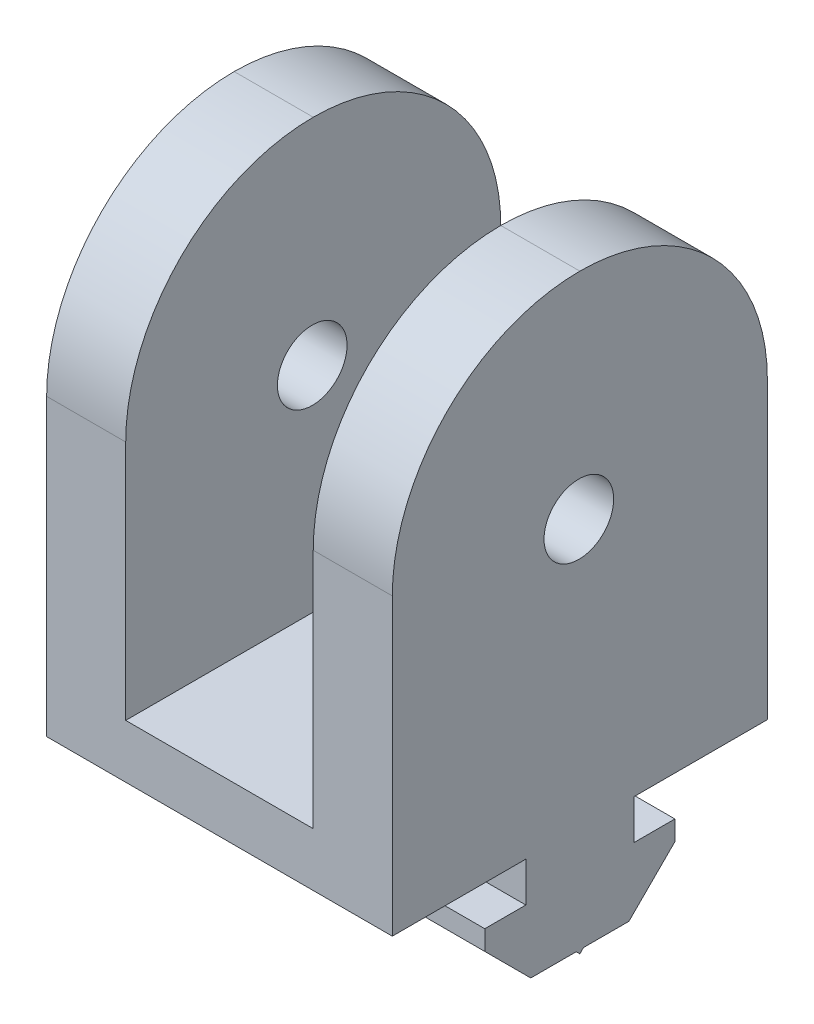
ISO-10303-21;
HEADER;
FILE_DESCRIPTION(('STEP AP214'),'2;1');
FILE_NAME('part.step','',(''),(''),'','','');
FILE_SCHEMA(('AUTOMOTIVE_DESIGN { 1 0 10303 214 1 1 1 1 }'));
ENDSEC;
DATA;
#1=APPLICATION_CONTEXT('core data for automotive mechanical design processes');
#2=APPLICATION_PROTOCOL_DEFINITION('international standard','automotive_design',2000,#1);
#3=PRODUCT_CONTEXT('',#1,'mechanical');
#4=PRODUCT('Part','Part','',(#3));
#5=PRODUCT_RELATED_PRODUCT_CATEGORY('part','',(#4));
#6=PRODUCT_DEFINITION_FORMATION('','',#4);
#7=PRODUCT_DEFINITION_CONTEXT('part definition',#1,'design');
#8=PRODUCT_DEFINITION('design','',#6,#7);
#9=PRODUCT_DEFINITION_SHAPE('','',#8);
#10=(LENGTH_UNIT() NAMED_UNIT(*) SI_UNIT(.MILLI.,.METRE.));
#11=(NAMED_UNIT(*) PLANE_ANGLE_UNIT() SI_UNIT($,.RADIAN.));
#12=(NAMED_UNIT(*) SI_UNIT($,.STERADIAN.) SOLID_ANGLE_UNIT());
#13=UNCERTAINTY_MEASURE_WITH_UNIT(LENGTH_MEASURE(1.E-05),#10,'distance_accuracy_value','');
#14=(GEOMETRIC_REPRESENTATION_CONTEXT(3) GLOBAL_UNCERTAINTY_ASSIGNED_CONTEXT((#13)) GLOBAL_UNIT_ASSIGNED_CONTEXT((#10,
#11,#12)) REPRESENTATION_CONTEXT('',''));
#15=CARTESIAN_POINT('',(0.,0.,0.));
#16=DIRECTION('',(0.,0.,1.));
#17=DIRECTION('',(1.,0.,0.));
#18=AXIS2_PLACEMENT_3D('',#15,#16,#17);
#19=CARTESIAN_POINT('',(0.,0.,0.));
#20=DIRECTION('',(0.,1.,0.));
#21=DIRECTION('',(0.,0.,1.));
#22=AXIS2_PLACEMENT_3D('',#19,#20,#21);
#23=PLANE('',#22);
#24=DIRECTION('',(1.,0.,0.));
#25=VECTOR('',#24,1.);
#26=CARTESIAN_POINT('',(-11.6351031276717,0.,-1.56619318181818));
#27=LINE('',#26,#25);
#28=CARTESIAN_POINT('',(-11.6351031276717,0.,-1.56619318181818));
#29=VERTEX_POINT('',#28);
#30=CARTESIAN_POINT('',(8.3648968723283,0.,-1.56619318181818));
#31=VERTEX_POINT('',#30);
#32=EDGE_CURVE('E284',#29,#31,#27,.T.);
#33=ORIENTED_EDGE('',*,*,#32,.F.);
#34=DIRECTION('',(0.,0.,-1.));
#35=VECTOR('',#34,1.);
#36=CARTESIAN_POINT('',(-11.6351031276717,0.,46.3308796469463));
#37=LINE('',#36,#35);
#38=CARTESIAN_POINT('',(-11.6351031276717,0.,-9.29119318181818));
#39=VERTEX_POINT('',#38);
#40=EDGE_CURVE('E311',#29,#39,#37,.T.);
#41=ORIENTED_EDGE('',*,*,#40,.T.);
#42=DIRECTION('',(-1.,0.,0.));
#43=VECTOR('',#42,1.);
#44=CARTESIAN_POINT('',(-18.8401031276717,0.,-9.29119318181818));
#45=LINE('',#44,#43);
#46=CARTESIAN_POINT('',(8.36489687232829,0.,-9.29119318181818));
#47=VERTEX_POINT('',#46);
#48=EDGE_CURVE('E350',#47,#39,#45,.T.);
#49=ORIENTED_EDGE('',*,*,#48,.F.);
#50=DIRECTION('',(0.,0.,-1.));
#51=VECTOR('',#50,1.);
#52=CARTESIAN_POINT('',(8.36489687232829,0.,46.3308796469463));
#53=LINE('',#52,#51);
#54=EDGE_CURVE('E302',#31,#47,#53,.T.);
#55=ORIENTED_EDGE('',*,*,#54,.F.);
#56=EDGE_LOOP('',(#33,#41,#49,#55));
#57=FACE_BOUND('',#56,.T.);
#58=ADVANCED_FACE('F34',(#57),#23,.F.);
#59=CARTESIAN_POINT('',(-18.8401031276717,3.1,12.4088068181818));
#60=DIRECTION('',(0.,0.,-1.));
#61=DIRECTION('',(-1.,0.,0.));
#62=AXIS2_PLACEMENT_3D('',#59,#60,#61);
#63=PLANE('',#62);
#64=DIRECTION('',(1.,0.,0.));
#65=VECTOR('',#64,1.);
#66=CARTESIAN_POINT('',(-18.8401031276717,0.,12.4088068181818));
#67=LINE('',#66,#65);
#68=CARTESIAN_POINT('',(-11.6351031276717,0.,12.4088068181818));
#69=VERTEX_POINT('',#68);
#70=CARTESIAN_POINT('',(8.36489687232829,0.,12.4088068181818));
#71=VERTEX_POINT('',#70);
#72=EDGE_CURVE('E345',#69,#71,#67,.T.);
#73=ORIENTED_EDGE('',*,*,#72,.T.);
#74=DIRECTION('',(0.,-1.,0.));
#75=VECTOR('',#74,1.);
#76=CARTESIAN_POINT('',(8.3648968723283,0.,12.4088068181818));
#77=LINE('',#76,#75);
#78=CARTESIAN_POINT('',(8.3648968723283,17.05,12.4088068181818));
#79=VERTEX_POINT('',#78);
#80=EDGE_CURVE('E296',#79,#71,#77,.T.);
#81=ORIENTED_EDGE('',*,*,#80,.F.);
#82=DIRECTION('',(1.,0.,0.));
#83=VECTOR('',#82,1.);
#84=CARTESIAN_POINT('',(3.7898968723283,17.05,12.4088068181818));
#85=LINE('',#84,#83);
#86=CARTESIAN_POINT('',(3.7898968723283,17.05,12.4088068181818));
#87=VERTEX_POINT('',#86);
#88=EDGE_CURVE('E360',#79,#87,#85,.F.);
#89=ORIENTED_EDGE('',*,*,#88,.T.);
#90=DIRECTION('',(0.,-1.,0.));
#91=VECTOR('',#90,1.);
#92=CARTESIAN_POINT('',(3.7898968723283,27.9,12.4088068181818));
#93=LINE('',#92,#91);
#94=CARTESIAN_POINT('',(3.7898968723283,3.1,12.4088068181818));
#95=VERTEX_POINT('',#94);
#96=EDGE_CURVE('E335',#87,#95,#93,.T.);
#97=ORIENTED_EDGE('',*,*,#96,.T.);
#98=DIRECTION('',(1.,0.,0.));
#99=VECTOR('',#98,1.);
#100=CARTESIAN_POINT('',(-18.8401031276717,3.1,12.4088068181818));
#101=LINE('',#100,#99);
#102=CARTESIAN_POINT('',(-7.0601031276717,3.1,12.4088068181818));
#103=VERTEX_POINT('',#102);
#104=EDGE_CURVE('E346',#103,#95,#101,.T.);
#105=ORIENTED_EDGE('',*,*,#104,.F.);
#106=DIRECTION('',(0.,-1.,0.));
#107=VECTOR('',#106,1.);
#108=CARTESIAN_POINT('',(-7.0601031276717,27.9,12.4088068181818));
#109=LINE('',#108,#107);
#110=CARTESIAN_POINT('',(-7.0601031276717,17.05,12.4088068181818));
#111=VERTEX_POINT('',#110);
#112=EDGE_CURVE('E343',#111,#103,#109,.T.);
#113=ORIENTED_EDGE('',*,*,#112,.F.);
#114=DIRECTION('',(1.,0.,0.));
#115=VECTOR('',#114,1.);
#116=CARTESIAN_POINT('',(-12.6401031276717,17.05,12.4088068181818));
#117=LINE('',#116,#115);
#118=CARTESIAN_POINT('',(-11.6351031276717,17.05,12.4088068181818));
#119=VERTEX_POINT('',#118);
#120=EDGE_CURVE('E353',#111,#119,#117,.F.);
#121=ORIENTED_EDGE('',*,*,#120,.T.);
#122=DIRECTION('',(0.,-1.,0.));
#123=VECTOR('',#122,1.);
#124=CARTESIAN_POINT('',(-11.6351031276717,0.,12.4088068181818));
#125=LINE('',#124,#123);
#126=EDGE_CURVE('E303',#119,#69,#125,.T.);
#127=ORIENTED_EDGE('',*,*,#126,.T.);
#128=EDGE_LOOP('',(#73,#81,#89,#97,#105,#113,#121,#127));
#129=FACE_BOUND('',#128,.T.);
#130=ADVANCED_FACE('F399',(#129),#63,.F.);
#131=CARTESIAN_POINT('',(-18.8401031276717,3.1,-9.29119318181818));
#132=DIRECTION('',(0.,0.,1.));
#133=DIRECTION('',(1.,0.,0.));
#134=AXIS2_PLACEMENT_3D('',#131,#132,#133);
#135=PLANE('',#134);
#136=DIRECTION('',(-1.,0.,0.));
#137=VECTOR('',#136,1.);
#138=CARTESIAN_POINT('',(9.3698968723283,17.05,-9.29119318181818));
#139=LINE('',#138,#137);
#140=CARTESIAN_POINT('',(3.7898968723283,17.05,-9.29119318181818));
#141=VERTEX_POINT('',#140);
#142=CARTESIAN_POINT('',(8.3648968723283,17.05,-9.29119318181818));
#143=VERTEX_POINT('',#142);
#144=EDGE_CURVE('E369',#141,#143,#139,.F.);
#145=ORIENTED_EDGE('',*,*,#144,.T.);
#146=DIRECTION('',(0.,1.,0.));
#147=VECTOR('',#146,1.);
#148=CARTESIAN_POINT('',(8.3648968723283,0.,-9.29119318181818));
#149=LINE('',#148,#147);
#150=EDGE_CURVE('E300',#47,#143,#149,.T.);
#151=ORIENTED_EDGE('',*,*,#150,.F.);
#152=ORIENTED_EDGE('',*,*,#48,.T.);
#153=DIRECTION('',(0.,1.,0.));
#154=VECTOR('',#153,1.);
#155=CARTESIAN_POINT('',(-11.6351031276717,0.,-9.29119318181818));
#156=LINE('',#155,#154);
#157=CARTESIAN_POINT('',(-11.6351031276717,17.05,-9.29119318181818));
#158=VERTEX_POINT('',#157);
#159=EDGE_CURVE('E271',#39,#158,#156,.T.);
#160=ORIENTED_EDGE('',*,*,#159,.T.);
#161=DIRECTION('',(-1.,0.,0.));
#162=VECTOR('',#161,1.);
#163=CARTESIAN_POINT('',(-7.0601031276717,17.05,-9.29119318181818));
#164=LINE('',#163,#162);
#165=CARTESIAN_POINT('',(-7.0601031276717,17.05,-9.29119318181818));
#166=VERTEX_POINT('',#165);
#167=EDGE_CURVE('E367',#158,#166,#164,.F.);
#168=ORIENTED_EDGE('',*,*,#167,.T.);
#169=DIRECTION('',(0.,-1.,0.));
#170=VECTOR('',#169,1.);
#171=CARTESIAN_POINT('',(-7.0601031276717,27.9,-9.29119318181818));
#172=LINE('',#171,#170);
#173=CARTESIAN_POINT('',(-7.0601031276717,3.1,-9.29119318181818));
#174=VERTEX_POINT('',#173);
#175=EDGE_CURVE('E340',#166,#174,#172,.T.);
#176=ORIENTED_EDGE('',*,*,#175,.T.);
#177=DIRECTION('',(-1.,0.,0.));
#178=VECTOR('',#177,1.);
#179=CARTESIAN_POINT('',(-18.8401031276717,3.1,-9.29119318181818));
#180=LINE('',#179,#178);
#181=CARTESIAN_POINT('',(3.7898968723283,3.1,-9.29119318181818));
#182=VERTEX_POINT('',#181);
#183=EDGE_CURVE('E349',#182,#174,#180,.T.);
#184=ORIENTED_EDGE('',*,*,#183,.F.);
#185=DIRECTION('',(0.,-1.,0.));
#186=VECTOR('',#185,1.);
#187=CARTESIAN_POINT('',(3.7898968723283,27.9,-9.29119318181818));
#188=LINE('',#187,#186);
#189=EDGE_CURVE('E332',#141,#182,#188,.T.);
#190=ORIENTED_EDGE('',*,*,#189,.F.);
#191=EDGE_LOOP('',(#145,#151,#152,#160,#168,#176,#184,#190));
#192=FACE_BOUND('',#191,.T.);
#193=ADVANCED_FACE('F406',(#192),#135,.F.);
#194=CARTESIAN_POINT('',(-11.6351031276717,0.,4.68380681818182));
#195=VERTEX_POINT('',#194);
#196=EDGE_CURVE('E308',#69,#195,#37,.T.);
#197=ORIENTED_EDGE('',*,*,#196,.T.);
#198=DIRECTION('',(1.,0.,0.));
#199=VECTOR('',#198,1.);
#200=CARTESIAN_POINT('',(-11.6351031276717,0.,4.68380681818182));
#201=LINE('',#200,#199);
#202=CARTESIAN_POINT('',(8.36489687232829,0.,4.68380681818182));
#203=VERTEX_POINT('',#202);
#204=EDGE_CURVE('E282',#195,#203,#201,.T.);
#205=ORIENTED_EDGE('',*,*,#204,.T.);
#206=EDGE_CURVE('E299',#71,#203,#53,.T.);
#207=ORIENTED_EDGE('',*,*,#206,.F.);
#208=ORIENTED_EDGE('',*,*,#72,.F.);
#209=EDGE_LOOP('',(#197,#205,#207,#208));
#210=FACE_BOUND('',#209,.T.);
#211=ADVANCED_FACE('F402',(#210),#23,.F.);
#212=CARTESIAN_POINT('',(0.,17.05,1.55880681818182));
#213=DIRECTION('',(-1.,0.,0.));
#214=DIRECTION('',(0.,0.,1.));
#215=AXIS2_PLACEMENT_3D('',#212,#213,#214);
#216=CYLINDRICAL_SURFACE('',#215,10.85);
#217=DIRECTION('',(1.,0.,0.));
#218=VECTOR('',#217,1.);
#219=CARTESIAN_POINT('',(-7.0601031276717,27.9,1.55880681818182));
#220=LINE('',#219,#218);
#221=CARTESIAN_POINT('',(-11.6351031276717,27.9,1.55880681818182));
#222=VERTEX_POINT('',#221);
#223=CARTESIAN_POINT('',(-7.0601031276717,27.9,1.55880681818182));
#224=VERTEX_POINT('',#223);
#225=EDGE_CURVE('E329',#222,#224,#220,.T.);
#226=ORIENTED_EDGE('',*,*,#225,.F.);
#227=CARTESIAN_POINT('',(-11.6351031276717,17.05,1.55880681818182));
#228=DIRECTION('',(-1.,0.,0.));
#229=DIRECTION('',(0.,0.,1.));
#230=AXIS2_PLACEMENT_3D('',#227,#228,#229);
#231=CIRCLE('',#230,10.85);
#232=EDGE_CURVE('E317',#222,#119,#231,.F.);
#233=ORIENTED_EDGE('',*,*,#232,.T.);
#234=ORIENTED_EDGE('',*,*,#120,.F.);
#235=CARTESIAN_POINT('',(-7.0601031276717,17.05,1.55880681818182));
#236=DIRECTION('',(-1.,0.,0.));
#237=DIRECTION('',(0.,0.,1.));
#238=AXIS2_PLACEMENT_3D('',#235,#236,#237);
#239=CIRCLE('',#238,10.85);
#240=EDGE_CURVE('E43',#224,#111,#239,.F.);
#241=ORIENTED_EDGE('',*,*,#240,.F.);
#242=EDGE_LOOP('',(#226,#233,#234,#241));
#243=FACE_BOUND('',#242,.T.);
#244=ADVANCED_FACE('F36',(#243),#216,.T.);
#245=CARTESIAN_POINT('',(0.,17.05,1.55880681818182));
#246=DIRECTION('',(1.,0.,0.));
#247=DIRECTION('',(0.,0.,-1.));
#248=AXIS2_PLACEMENT_3D('',#245,#246,#247);
#249=CYLINDRICAL_SURFACE('',#248,10.85);
#250=ORIENTED_EDGE('',*,*,#167,.F.);
#251=CARTESIAN_POINT('',(-11.6351031276717,17.05,1.55880681818182));
#252=DIRECTION('',(-1.,0.,0.));
#253=DIRECTION('',(0.,0.,1.));
#254=AXIS2_PLACEMENT_3D('',#251,#252,#253);
#255=CIRCLE('',#254,10.85);
#256=EDGE_CURVE('E314',#158,#222,#255,.F.);
#257=ORIENTED_EDGE('',*,*,#256,.T.);
#258=ORIENTED_EDGE('',*,*,#225,.T.);
#259=CARTESIAN_POINT('',(-7.0601031276717,17.05,1.55880681818182));
#260=DIRECTION('',(-1.,0.,0.));
#261=DIRECTION('',(0.,0.,1.));
#262=AXIS2_PLACEMENT_3D('',#259,#260,#261);
#263=CIRCLE('',#262,10.85);
#264=EDGE_CURVE('E11',#166,#224,#263,.F.);
#265=ORIENTED_EDGE('',*,*,#264,.F.);
#266=EDGE_LOOP('',(#250,#257,#258,#265));
#267=FACE_BOUND('',#266,.T.);
#268=ADVANCED_FACE('F380',(#267),#249,.T.);
#269=CARTESIAN_POINT('',(27.6598968723283,15.5,1.61572996420886));
#270=DIRECTION('',(-1.,0.,0.));
#271=DIRECTION('',(0.,0.,1.));
#272=AXIS2_PLACEMENT_3D('',#269,#270,#271);
#273=CYLINDRICAL_SURFACE('',#272,2.015);
#274=CARTESIAN_POINT('',(-7.0601031276717,15.5,1.61572996420886));
#275=DIRECTION('',(-1.,0.,0.));
#276=DIRECTION('',(0.,0.,1.));
#277=AXIS2_PLACEMENT_3D('',#274,#275,#276);
#278=CIRCLE('',#277,2.015);
#279=CARTESIAN_POINT('',(-7.0601031276717,15.5,3.63072996420886));
#280=VERTEX_POINT('',#279);
#281=EDGE_CURVE('E326',#280,#280,#278,.T.);
#282=ORIENTED_EDGE('',*,*,#281,.F.);
#283=EDGE_LOOP('',(#282));
#284=FACE_BOUND('',#283,.T.);
#285=CARTESIAN_POINT('',(-11.6351031276717,15.5,1.61572996420886));
#286=DIRECTION('',(-1.,0.,0.));
#287=DIRECTION('',(0.,0.,1.));
#288=AXIS2_PLACEMENT_3D('',#285,#286,#287);
#289=CIRCLE('',#288,2.015);
#290=CARTESIAN_POINT('',(-11.6351031276717,15.5,3.63072996420886));
#291=VERTEX_POINT('',#290);
#292=EDGE_CURVE('E298',#291,#291,#289,.F.);
#293=ORIENTED_EDGE('',*,*,#292,.F.);
#294=EDGE_LOOP('',(#293));
#295=FACE_BOUND('',#294,.T.);
#296=ADVANCED_FACE('F377',(#284,#295),#273,.F.);
#297=CARTESIAN_POINT('',(0.,3.1,0.));
#298=DIRECTION('',(0.,1.,0.));
#299=DIRECTION('',(0.,0.,1.));
#300=AXIS2_PLACEMENT_3D('',#297,#298,#299);
#301=PLANE('',#300);
#302=ORIENTED_EDGE('',*,*,#104,.T.);
#303=DIRECTION('',(0.,0.,1.));
#304=VECTOR('',#303,1.);
#305=CARTESIAN_POINT('',(3.7898968723283,3.1,-9.29119318181818));
#306=LINE('',#305,#304);
#307=EDGE_CURVE('E330',#182,#95,#306,.T.);
#308=ORIENTED_EDGE('',*,*,#307,.F.);
#309=ORIENTED_EDGE('',*,*,#183,.T.);
#310=DIRECTION('',(0.,0.,-1.));
#311=VECTOR('',#310,1.);
#312=CARTESIAN_POINT('',(-7.0601031276717,3.1,-9.29119318181818));
#313=LINE('',#312,#311);
#314=EDGE_CURVE('E338',#103,#174,#313,.T.);
#315=ORIENTED_EDGE('',*,*,#314,.F.);
#316=EDGE_LOOP('',(#302,#308,#309,#315));
#317=FACE_BOUND('',#316,.T.);
#318=ADVANCED_FACE('F379',(#317),#301,.T.);
#319=CARTESIAN_POINT('',(-7.0601031276717,27.9,-9.29119318181818));
#320=DIRECTION('',(-1.,0.,0.));
#321=DIRECTION('',(0.,0.,1.));
#322=AXIS2_PLACEMENT_3D('',#319,#320,#321);
#323=PLANE('',#322);
#324=ORIENTED_EDGE('',*,*,#314,.T.);
#325=ORIENTED_EDGE('',*,*,#175,.F.);
#326=ORIENTED_EDGE('',*,*,#264,.T.);
#327=ORIENTED_EDGE('',*,*,#240,.T.);
#328=ORIENTED_EDGE('',*,*,#112,.T.);
#329=EDGE_LOOP('',(#324,#325,#326,#327,#328));
#330=FACE_BOUND('',#329,.T.);
#331=ORIENTED_EDGE('',*,*,#281,.T.);
#332=EDGE_LOOP('',(#331));
#333=FACE_BOUND('',#332,.T.);
#334=ADVANCED_FACE('F388',(#330,#333),#323,.F.);
#335=CARTESIAN_POINT('',(3.7898968723283,27.9,-9.29119318181818));
#336=DIRECTION('',(1.,0.,0.));
#337=DIRECTION('',(0.,0.,-1.));
#338=AXIS2_PLACEMENT_3D('',#335,#336,#337);
#339=PLANE('',#338);
#340=CARTESIAN_POINT('',(3.7898968723283,15.5,1.61572996420886));
#341=DIRECTION('',(1.,0.,0.));
#342=DIRECTION('',(0.,0.,-1.));
#343=AXIS2_PLACEMENT_3D('',#340,#341,#342);
#344=CIRCLE('',#343,2.015);
#345=CARTESIAN_POINT('',(3.7898968723283,15.5,-0.399270035791137));
#346=VERTEX_POINT('',#345);
#347=EDGE_CURVE('E323',#346,#346,#344,.T.);
#348=ORIENTED_EDGE('',*,*,#347,.T.);
#349=EDGE_LOOP('',(#348));
#350=FACE_BOUND('',#349,.T.);
#351=ORIENTED_EDGE('',*,*,#307,.T.);
#352=ORIENTED_EDGE('',*,*,#96,.F.);
#353=CARTESIAN_POINT('',(3.7898968723283,17.05,1.55880681818182));
#354=DIRECTION('',(1.,0.,0.));
#355=DIRECTION('',(0.,0.,-1.));
#356=AXIS2_PLACEMENT_3D('',#353,#354,#355);
#357=CIRCLE('',#356,10.85);
#358=CARTESIAN_POINT('',(3.7898968723283,27.9,1.55880681818182));
#359=VERTEX_POINT('',#358);
#360=EDGE_CURVE('E364',#87,#359,#357,.F.);
#361=ORIENTED_EDGE('',*,*,#360,.T.);
#362=CARTESIAN_POINT('',(3.7898968723283,17.05,1.55880681818182));
#363=DIRECTION('',(1.,0.,0.));
#364=DIRECTION('',(0.,0.,-1.));
#365=AXIS2_PLACEMENT_3D('',#362,#363,#364);
#366=CIRCLE('',#365,10.85);
#367=EDGE_CURVE('E362',#359,#141,#366,.F.);
#368=ORIENTED_EDGE('',*,*,#367,.T.);
#369=ORIENTED_EDGE('',*,*,#189,.T.);
#370=EDGE_LOOP('',(#351,#352,#361,#368,#369));
#371=FACE_BOUND('',#370,.T.);
#372=ADVANCED_FACE('F482',(#350,#371),#339,.F.);
#373=CARTESIAN_POINT('',(0.,17.05,1.55880681818182));
#374=DIRECTION('',(1.,0.,0.));
#375=DIRECTION('',(0.,0.,-1.));
#376=AXIS2_PLACEMENT_3D('',#373,#374,#375);
#377=CYLINDRICAL_SURFACE('',#376,10.85);
#378=CARTESIAN_POINT('',(8.3648968723283,17.05,1.55880681818182));
#379=DIRECTION('',(-1.,0.,0.));
#380=DIRECTION('',(0.,0.,1.));
#381=AXIS2_PLACEMENT_3D('',#378,#379,#380);
#382=CIRCLE('',#381,10.85);
#383=CARTESIAN_POINT('',(8.3648968723283,27.9,1.55880681818182));
#384=VERTEX_POINT('',#383);
#385=EDGE_CURVE('E59',#143,#384,#382,.F.);
#386=ORIENTED_EDGE('',*,*,#385,.F.);
#387=ORIENTED_EDGE('',*,*,#144,.F.);
#388=ORIENTED_EDGE('',*,*,#367,.F.);
#389=DIRECTION('',(-1.,0.,0.));
#390=VECTOR('',#389,1.);
#391=CARTESIAN_POINT('',(3.7898968723283,27.9,1.55880681818182));
#392=LINE('',#391,#390);
#393=EDGE_CURVE('E333',#384,#359,#392,.T.);
#394=ORIENTED_EDGE('',*,*,#393,.F.);
#395=EDGE_LOOP('',(#386,#387,#388,#394));
#396=FACE_BOUND('',#395,.T.);
#397=ADVANCED_FACE('F492',(#396),#377,.T.);
#398=CARTESIAN_POINT('',(0.,17.05,1.55880681818182));
#399=DIRECTION('',(-1.,0.,0.));
#400=DIRECTION('',(0.,0.,1.));
#401=AXIS2_PLACEMENT_3D('',#398,#399,#400);
#402=CYLINDRICAL_SURFACE('',#401,10.85);
#403=CARTESIAN_POINT('',(8.3648968723283,17.05,1.55880681818182));
#404=DIRECTION('',(-1.,0.,0.));
#405=DIRECTION('',(0.,0.,1.));
#406=AXIS2_PLACEMENT_3D('',#403,#404,#405);
#407=CIRCLE('',#406,10.85);
#408=EDGE_CURVE('E320',#384,#79,#407,.F.);
#409=ORIENTED_EDGE('',*,*,#408,.F.);
#410=ORIENTED_EDGE('',*,*,#393,.T.);
#411=ORIENTED_EDGE('',*,*,#360,.F.);
#412=ORIENTED_EDGE('',*,*,#88,.F.);
#413=EDGE_LOOP('',(#409,#410,#411,#412));
#414=FACE_BOUND('',#413,.T.);
#415=ADVANCED_FACE('F396',(#414),#402,.T.);
#416=CARTESIAN_POINT('',(8.3648968723283,15.5,1.61572996420886));
#417=DIRECTION('',(-1.,0.,0.));
#418=DIRECTION('',(0.,0.,1.));
#419=AXIS2_PLACEMENT_3D('',#416,#417,#418);
#420=CIRCLE('',#419,2.015);
#421=CARTESIAN_POINT('',(8.3648968723283,15.5,3.63072996420886));
#422=VERTEX_POINT('',#421);
#423=EDGE_CURVE('E38',#422,#422,#420,.F.);
#424=ORIENTED_EDGE('',*,*,#423,.T.);
#425=EDGE_LOOP('',(#424));
#426=FACE_BOUND('',#425,.T.);
#427=ORIENTED_EDGE('',*,*,#347,.F.);
#428=EDGE_LOOP('',(#427));
#429=FACE_BOUND('',#428,.T.);
#430=ADVANCED_FACE('F383',(#426,#429),#273,.F.);
#431=CARTESIAN_POINT('',(-11.6351031276717,0.,46.3308796469463));
#432=DIRECTION('',(-1.,0.,0.));
#433=DIRECTION('',(0.,0.,1.));
#434=AXIS2_PLACEMENT_3D('',#431,#432,#433);
#435=PLANE('',#434);
#436=ORIENTED_EDGE('',*,*,#256,.F.);
#437=ORIENTED_EDGE('',*,*,#159,.F.);
#438=ORIENTED_EDGE('',*,*,#40,.F.);
#439=DIRECTION('',(0.,-1.,0.));
#440=VECTOR('',#439,1.);
#441=CARTESIAN_POINT('',(-11.6351031276717,0.,-1.56619318181818));
#442=LINE('',#441,#440);
#443=CARTESIAN_POINT('',(-11.6351031276717,-2.29999999999999,-1.56619318181818));
#444=VERTEX_POINT('',#443);
#445=EDGE_CURVE('E230',#29,#444,#442,.T.);
#446=ORIENTED_EDGE('',*,*,#445,.T.);
#447=DIRECTION('',(0.,0.,-1.));
#448=VECTOR('',#447,1.);
#449=CARTESIAN_POINT('',(-11.6351031276717,-2.29999999999999,0.));
#450=LINE('',#449,#448);
#451=CARTESIAN_POINT('',(-11.6351031276717,-2.29999999999999,-3.94119318181818));
#452=VERTEX_POINT('',#451);
#453=EDGE_CURVE('E228',#444,#452,#450,.T.);
#454=ORIENTED_EDGE('',*,*,#453,.T.);
#455=DIRECTION('',(0.,1.,0.));
#456=VECTOR('',#455,1.);
#457=CARTESIAN_POINT('',(-11.6351031276717,0.,-3.94119318181818));
#458=LINE('',#457,#456);
#459=CARTESIAN_POINT('',(-11.6351031276717,-3.43933982822025,-3.94119318181818));
#460=VERTEX_POINT('',#459);
#461=EDGE_CURVE('E225',#460,#452,#458,.T.);
#462=ORIENTED_EDGE('',*,*,#461,.F.);
#463=DIRECTION('',(0.,0.707106781186544,-0.707106781186551));
#464=VECTOR('',#463,1.);
#465=CARTESIAN_POINT('',(-11.6351031276717,-3.69026650501923,-3.69026650501919));
#466=LINE('',#465,#464);
#467=CARTESIAN_POINT('',(-11.6351031276717,-6.1,-1.2805330100384));
#468=VERTEX_POINT('',#467);
#469=EDGE_CURVE('E220',#468,#460,#466,.T.);
#470=ORIENTED_EDGE('',*,*,#469,.F.);
#471=DIRECTION('',(0.,0.,-1.));
#472=VECTOR('',#471,1.);
#473=CARTESIAN_POINT('',(-11.6351031276717,-6.1,0.));
#474=LINE('',#473,#472);
#475=CARTESIAN_POINT('',(-11.6351031276717,-6.1,1.34880681818182));
#476=VERTEX_POINT('',#475);
#477=EDGE_CURVE('E218',#476,#468,#474,.T.);
#478=ORIENTED_EDGE('',*,*,#477,.F.);
#479=DIRECTION('',(0.,0.707106781186544,-0.707106781186551));
#480=VECTOR('',#479,1.);
#481=CARTESIAN_POINT('',(-11.6351031276717,-2.37559659090912,-2.3755965909091));
#482=LINE('',#481,#480);
#483=CARTESIAN_POINT('',(-11.6351031276717,-6.31,1.55880681818182));
#484=VERTEX_POINT('',#483);
#485=EDGE_CURVE('E195',#484,#476,#482,.T.);
#486=ORIENTED_EDGE('',*,*,#485,.F.);
#487=DIRECTION('',(0.,0.707106781186544,0.707106781186551));
#488=VECTOR('',#487,1.);
#489=CARTESIAN_POINT('',(-11.6351031276717,-3.93440340909094,3.9344034090909));
#490=LINE('',#489,#488);
#491=CARTESIAN_POINT('',(-11.6351031276717,-6.1,1.76880681818182));
#492=VERTEX_POINT('',#491);
#493=EDGE_CURVE('E206',#484,#492,#490,.T.);
#494=ORIENTED_EDGE('',*,*,#493,.T.);
#495=DIRECTION('',(0.,0.,1.));
#496=VECTOR('',#495,1.);
#497=CARTESIAN_POINT('',(-11.6351031276717,-6.1,0.));
#498=LINE('',#497,#496);
#499=CARTESIAN_POINT('',(-11.6351031276717,-6.1,4.39814664640204));
#500=VERTEX_POINT('',#499);
#501=EDGE_CURVE('E202',#492,#500,#498,.T.);
#502=ORIENTED_EDGE('',*,*,#501,.T.);
#503=DIRECTION('',(0.,0.707106781186544,0.707106781186551));
#504=VECTOR('',#503,1.);
#505=CARTESIAN_POINT('',(-11.6351031276717,-5.24907332320105,5.24907332320099));
#506=LINE('',#505,#504);
#507=CARTESIAN_POINT('',(-11.6351031276717,-3.43933982822025,7.05880681818182));
#508=VERTEX_POINT('',#507);
#509=EDGE_CURVE('E240',#500,#508,#506,.T.);
#510=ORIENTED_EDGE('',*,*,#509,.T.);
#511=DIRECTION('',(0.,1.,0.));
#512=VECTOR('',#511,1.);
#513=CARTESIAN_POINT('',(-11.6351031276717,0.,7.05880681818182));
#514=LINE('',#513,#512);
#515=CARTESIAN_POINT('',(-11.6351031276717,-2.29999999999999,7.05880681818182));
#516=VERTEX_POINT('',#515);
#517=EDGE_CURVE('E238',#508,#516,#514,.T.);
#518=ORIENTED_EDGE('',*,*,#517,.T.);
#519=DIRECTION('',(0.,0.,1.));
#520=VECTOR('',#519,1.);
#521=CARTESIAN_POINT('',(-11.6351031276717,-2.29999999999999,0.));
#522=LINE('',#521,#520);
#523=CARTESIAN_POINT('',(-11.6351031276717,-2.29999999999999,4.68380681818182));
#524=VERTEX_POINT('',#523);
#525=EDGE_CURVE('E235',#524,#516,#522,.T.);
#526=ORIENTED_EDGE('',*,*,#525,.F.);
#527=DIRECTION('',(0.,-1.,0.));
#528=VECTOR('',#527,1.);
#529=CARTESIAN_POINT('',(-11.6351031276717,0.,4.68380681818182));
#530=LINE('',#529,#528);
#531=EDGE_CURVE('E232',#195,#524,#530,.T.);
#532=ORIENTED_EDGE('',*,*,#531,.F.);
#533=ORIENTED_EDGE('',*,*,#196,.F.);
#534=ORIENTED_EDGE('',*,*,#126,.F.);
#535=ORIENTED_EDGE('',*,*,#232,.F.);
#536=EDGE_LOOP('',(#436,#437,#438,#446,#454,#462,#470,#478,#486,#494,#502,#510,#518,#526,#532,
#533,#534,#535));
#537=FACE_BOUND('',#536,.T.);
#538=ORIENTED_EDGE('',*,*,#292,.T.);
#539=EDGE_LOOP('',(#538));
#540=FACE_BOUND('',#539,.T.);
#541=ADVANCED_FACE('F214',(#537,#540),#435,.T.);
#542=CARTESIAN_POINT('',(8.3648968723283,0.,46.3308796469463));
#543=DIRECTION('',(-1.,0.,0.));
#544=DIRECTION('',(0.,0.,1.));
#545=AXIS2_PLACEMENT_3D('',#542,#543,#544);
#546=PLANE('',#545);
#547=ORIENTED_EDGE('',*,*,#385,.T.);
#548=ORIENTED_EDGE('',*,*,#408,.T.);
#549=ORIENTED_EDGE('',*,*,#80,.T.);
#550=ORIENTED_EDGE('',*,*,#206,.T.);
#551=DIRECTION('',(0.,-1.,0.));
#552=VECTOR('',#551,1.);
#553=CARTESIAN_POINT('',(8.3648968723283,0.,4.68380681818182));
#554=LINE('',#553,#552);
#555=CARTESIAN_POINT('',(8.3648968723283,-2.29999999999999,4.68380681818182));
#556=VERTEX_POINT('',#555);
#557=EDGE_CURVE('E51',#203,#556,#554,.T.);
#558=ORIENTED_EDGE('',*,*,#557,.T.);
#559=DIRECTION('',(0.,0.,1.));
#560=VECTOR('',#559,1.);
#561=CARTESIAN_POINT('',(8.3648968723283,-2.29999999999999,0.));
#562=LINE('',#561,#560);
#563=CARTESIAN_POINT('',(8.3648968723283,-2.29999999999999,7.05880681818182));
#564=VERTEX_POINT('',#563);
#565=EDGE_CURVE('E261',#556,#564,#562,.T.);
#566=ORIENTED_EDGE('',*,*,#565,.T.);
#567=DIRECTION('',(0.,1.,0.));
#568=VECTOR('',#567,1.);
#569=CARTESIAN_POINT('',(8.3648968723283,0.,7.05880681818182));
#570=LINE('',#569,#568);
#571=CARTESIAN_POINT('',(8.3648968723283,-3.43933982822025,7.05880681818182));
#572=VERTEX_POINT('',#571);
#573=EDGE_CURVE('E264',#572,#564,#570,.T.);
#574=ORIENTED_EDGE('',*,*,#573,.F.);
#575=DIRECTION('',(0.,0.707106781186544,0.707106781186551));
#576=VECTOR('',#575,1.);
#577=CARTESIAN_POINT('',(8.3648968723283,-5.24907332320105,5.24907332320099));
#578=LINE('',#577,#576);
#579=CARTESIAN_POINT('',(8.3648968723283,-6.1,4.39814664640204));
#580=VERTEX_POINT('',#579);
#581=EDGE_CURVE('E267',#580,#572,#578,.T.);
#582=ORIENTED_EDGE('',*,*,#581,.F.);
#583=DIRECTION('',(0.,0.,1.));
#584=VECTOR('',#583,1.);
#585=CARTESIAN_POINT('',(8.3648968723283,-6.1,0.));
#586=LINE('',#585,#584);
#587=CARTESIAN_POINT('',(8.3648968723283,-6.1,1.76880681818182));
#588=VERTEX_POINT('',#587);
#589=EDGE_CURVE('E211',#588,#580,#586,.T.);
#590=ORIENTED_EDGE('',*,*,#589,.F.);
#591=DIRECTION('',(0.,0.707106781186544,0.707106781186551));
#592=VECTOR('',#591,1.);
#593=CARTESIAN_POINT('',(8.3648968723283,-3.93440340909094,3.9344034090909));
#594=LINE('',#593,#592);
#595=CARTESIAN_POINT('',(8.3648968723283,-6.31,1.55880681818182));
#596=VERTEX_POINT('',#595);
#597=EDGE_CURVE('E243',#596,#588,#594,.T.);
#598=ORIENTED_EDGE('',*,*,#597,.F.);
#599=DIRECTION('',(0.,0.707106781186544,-0.707106781186551));
#600=VECTOR('',#599,1.);
#601=CARTESIAN_POINT('',(8.3648968723283,-2.37559659090912,-2.3755965909091));
#602=LINE('',#601,#600);
#603=CARTESIAN_POINT('',(8.3648968723283,-6.1,1.34880681818182));
#604=VERTEX_POINT('',#603);
#605=EDGE_CURVE('E197',#596,#604,#602,.T.);
#606=ORIENTED_EDGE('',*,*,#605,.T.);
#607=DIRECTION('',(0.,0.,-1.));
#608=VECTOR('',#607,1.);
#609=CARTESIAN_POINT('',(8.3648968723283,-6.1,0.));
#610=LINE('',#609,#608);
#611=CARTESIAN_POINT('',(8.3648968723283,-6.1,-1.2805330100384));
#612=VERTEX_POINT('',#611);
#613=EDGE_CURVE('E246',#604,#612,#610,.T.);
#614=ORIENTED_EDGE('',*,*,#613,.T.);
#615=DIRECTION('',(0.,0.707106781186544,-0.707106781186551));
#616=VECTOR('',#615,1.);
#617=CARTESIAN_POINT('',(8.3648968723283,-3.69026650501923,-3.69026650501919));
#618=LINE('',#617,#616);
#619=CARTESIAN_POINT('',(8.3648968723283,-3.43933982822025,-3.94119318181818));
#620=VERTEX_POINT('',#619);
#621=EDGE_CURVE('E249',#612,#620,#618,.T.);
#622=ORIENTED_EDGE('',*,*,#621,.T.);
#623=DIRECTION('',(0.,1.,0.));
#624=VECTOR('',#623,1.);
#625=CARTESIAN_POINT('',(8.3648968723283,0.,-3.94119318181818));
#626=LINE('',#625,#624);
#627=CARTESIAN_POINT('',(8.3648968723283,-2.29999999999999,-3.94119318181818));
#628=VERTEX_POINT('',#627);
#629=EDGE_CURVE('E252',#620,#628,#626,.T.);
#630=ORIENTED_EDGE('',*,*,#629,.T.);
#631=DIRECTION('',(0.,0.,-1.));
#632=VECTOR('',#631,1.);
#633=CARTESIAN_POINT('',(8.3648968723283,-2.29999999999999,0.));
#634=LINE('',#633,#632);
#635=CARTESIAN_POINT('',(8.3648968723283,-2.29999999999999,-1.56619318181818));
#636=VERTEX_POINT('',#635);
#637=EDGE_CURVE('E255',#636,#628,#634,.T.);
#638=ORIENTED_EDGE('',*,*,#637,.F.);
#639=DIRECTION('',(0.,-1.,0.));
#640=VECTOR('',#639,1.);
#641=CARTESIAN_POINT('',(8.3648968723283,0.,-1.56619318181818));
#642=LINE('',#641,#640);
#643=EDGE_CURVE('E258',#31,#636,#642,.T.);
#644=ORIENTED_EDGE('',*,*,#643,.F.);
#645=ORIENTED_EDGE('',*,*,#54,.T.);
#646=ORIENTED_EDGE('',*,*,#150,.T.);
#647=EDGE_LOOP('',(#547,#548,#549,#550,#558,#566,#574,#582,#590,#598,#606,#614,#622,#630,#638,
#644,#645,#646));
#648=FACE_BOUND('',#647,.T.);
#649=ORIENTED_EDGE('',*,*,#423,.F.);
#650=EDGE_LOOP('',(#649));
#651=FACE_BOUND('',#650,.T.);
#652=ADVANCED_FACE('F443',(#648,#651),#546,.F.);
#653=CARTESIAN_POINT('',(-11.6351031276717,-3.93440340909094,3.9344034090909));
#654=DIRECTION('',(0.,0.707106781186551,-0.707106781186544));
#655=DIRECTION('',(0.,0.707106781186544,0.707106781186551));
#656=AXIS2_PLACEMENT_3D('',#653,#654,#655);
#657=PLANE('',#656);
#658=ORIENTED_EDGE('',*,*,#597,.T.);
#659=DIRECTION('',(1.,0.,0.));
#660=VECTOR('',#659,1.);
#661=CARTESIAN_POINT('',(-11.6351031276717,-6.1,1.76880681818182));
#662=LINE('',#661,#660);
#663=EDGE_CURVE('E209',#492,#588,#662,.T.);
#664=ORIENTED_EDGE('',*,*,#663,.F.);
#665=ORIENTED_EDGE('',*,*,#493,.F.);
#666=DIRECTION('',(1.,0.,0.));
#667=VECTOR('',#666,1.);
#668=CARTESIAN_POINT('',(-11.6351031276717,-6.31,1.55880681818182));
#669=LINE('',#668,#667);
#670=EDGE_CURVE('E191',#484,#596,#669,.T.);
#671=ORIENTED_EDGE('',*,*,#670,.T.);
#672=EDGE_LOOP('',(#658,#664,#665,#671));
#673=FACE_BOUND('',#672,.T.);
#674=ADVANCED_FACE('F207',(#673),#657,.F.);
#675=CARTESIAN_POINT('',(-11.6351031276717,-6.1,0.));
#676=DIRECTION('',(0.,1.,0.));
#677=DIRECTION('',(0.,0.,1.));
#678=AXIS2_PLACEMENT_3D('',#675,#676,#677);
#679=PLANE('',#678);
#680=ORIENTED_EDGE('',*,*,#589,.T.);
#681=DIRECTION('',(1.,0.,0.));
#682=VECTOR('',#681,1.);
#683=CARTESIAN_POINT('',(-11.6351031276717,-6.1,4.39814664640204));
#684=LINE('',#683,#682);
#685=EDGE_CURVE('E272',#500,#580,#684,.T.);
#686=ORIENTED_EDGE('',*,*,#685,.F.);
#687=ORIENTED_EDGE('',*,*,#501,.F.);
#688=ORIENTED_EDGE('',*,*,#663,.T.);
#689=EDGE_LOOP('',(#680,#686,#687,#688));
#690=FACE_BOUND('',#689,.T.);
#691=ADVANCED_FACE('F462',(#690),#679,.F.);
#692=CARTESIAN_POINT('',(-11.6351031276717,-5.24907332320105,5.24907332320099));
#693=DIRECTION('',(0.,0.707106781186551,-0.707106781186544));
#694=DIRECTION('',(0.,0.707106781186544,0.707106781186551));
#695=AXIS2_PLACEMENT_3D('',#692,#693,#694);
#696=PLANE('',#695);
#697=ORIENTED_EDGE('',*,*,#581,.T.);
#698=DIRECTION('',(1.,0.,0.));
#699=VECTOR('',#698,1.);
#700=CARTESIAN_POINT('',(-11.6351031276717,-3.43933982822025,7.05880681818182));
#701=LINE('',#700,#699);
#702=EDGE_CURVE('E275',#508,#572,#701,.T.);
#703=ORIENTED_EDGE('',*,*,#702,.F.);
#704=ORIENTED_EDGE('',*,*,#509,.F.);
#705=ORIENTED_EDGE('',*,*,#685,.T.);
#706=EDGE_LOOP('',(#697,#703,#704,#705));
#707=FACE_BOUND('',#706,.T.);
#708=ADVANCED_FACE('F468',(#707),#696,.F.);
#709=CARTESIAN_POINT('',(-11.6351031276717,0.,7.05880681818182));
#710=DIRECTION('',(0.,0.,-1.));
#711=DIRECTION('',(-1.,0.,0.));
#712=AXIS2_PLACEMENT_3D('',#709,#710,#711);
#713=PLANE('',#712);
#714=ORIENTED_EDGE('',*,*,#573,.T.);
#715=DIRECTION('',(1.,0.,0.));
#716=VECTOR('',#715,1.);
#717=CARTESIAN_POINT('',(-11.6351031276717,-2.29999999999999,7.05880681818182));
#718=LINE('',#717,#716);
#719=EDGE_CURVE('E278',#516,#564,#718,.T.);
#720=ORIENTED_EDGE('',*,*,#719,.F.);
#721=ORIENTED_EDGE('',*,*,#517,.F.);
#722=ORIENTED_EDGE('',*,*,#702,.T.);
#723=EDGE_LOOP('',(#714,#720,#721,#722));
#724=FACE_BOUND('',#723,.T.);
#725=ADVANCED_FACE('F470',(#724),#713,.F.);
#726=CARTESIAN_POINT('',(-11.6351031276717,-2.29999999999999,0.));
#727=DIRECTION('',(0.,1.,0.));
#728=DIRECTION('',(0.,0.,1.));
#729=AXIS2_PLACEMENT_3D('',#726,#727,#728);
#730=PLANE('',#729);
#731=ORIENTED_EDGE('',*,*,#565,.F.);
#732=DIRECTION('',(1.,0.,0.));
#733=VECTOR('',#732,1.);
#734=CARTESIAN_POINT('',(-11.6351031276717,-2.29999999999999,4.68380681818182));
#735=LINE('',#734,#733);
#736=EDGE_CURVE('E280',#524,#556,#735,.T.);
#737=ORIENTED_EDGE('',*,*,#736,.F.);
#738=ORIENTED_EDGE('',*,*,#525,.T.);
#739=ORIENTED_EDGE('',*,*,#719,.T.);
#740=EDGE_LOOP('',(#731,#737,#738,#739));
#741=FACE_BOUND('',#740,.T.);
#742=ADVANCED_FACE('F473',(#741),#730,.T.);
#743=CARTESIAN_POINT('',(-11.6351031276717,0.,4.68380681818182));
#744=DIRECTION('',(0.,0.,1.));
#745=DIRECTION('',(1.,0.,0.));
#746=AXIS2_PLACEMENT_3D('',#743,#744,#745);
#747=PLANE('',#746);
#748=ORIENTED_EDGE('',*,*,#557,.F.);
#749=ORIENTED_EDGE('',*,*,#204,.F.);
#750=ORIENTED_EDGE('',*,*,#531,.T.);
#751=ORIENTED_EDGE('',*,*,#736,.T.);
#752=EDGE_LOOP('',(#748,#749,#750,#751));
#753=FACE_BOUND('',#752,.T.);
#754=ADVANCED_FACE('F474',(#753),#747,.T.);
#755=CARTESIAN_POINT('',(-11.6351031276717,0.,-1.56619318181818));
#756=DIRECTION('',(0.,0.,1.));
#757=DIRECTION('',(1.,0.,0.));
#758=AXIS2_PLACEMENT_3D('',#755,#756,#757);
#759=PLANE('',#758);
#760=ORIENTED_EDGE('',*,*,#643,.T.);
#761=DIRECTION('',(1.,0.,0.));
#762=VECTOR('',#761,1.);
#763=CARTESIAN_POINT('',(-11.6351031276717,-2.29999999999999,-1.56619318181818));
#764=LINE('',#763,#762);
#765=EDGE_CURVE('E286',#444,#636,#764,.T.);
#766=ORIENTED_EDGE('',*,*,#765,.F.);
#767=ORIENTED_EDGE('',*,*,#445,.F.);
#768=ORIENTED_EDGE('',*,*,#32,.T.);
#769=EDGE_LOOP('',(#760,#766,#767,#768));
#770=FACE_BOUND('',#769,.T.);
#771=ADVANCED_FACE('F441',(#770),#759,.F.);
#772=CARTESIAN_POINT('',(-11.6351031276717,-2.29999999999999,0.));
#773=DIRECTION('',(0.,-1.,0.));
#774=DIRECTION('',(0.,0.,-1.));
#775=AXIS2_PLACEMENT_3D('',#772,#773,#774);
#776=PLANE('',#775);
#777=ORIENTED_EDGE('',*,*,#637,.T.);
#778=DIRECTION('',(1.,0.,0.));
#779=VECTOR('',#778,1.);
#780=CARTESIAN_POINT('',(-11.6351031276717,-2.29999999999999,-3.94119318181818));
#781=LINE('',#780,#779);
#782=EDGE_CURVE('E289',#452,#628,#781,.T.);
#783=ORIENTED_EDGE('',*,*,#782,.F.);
#784=ORIENTED_EDGE('',*,*,#453,.F.);
#785=ORIENTED_EDGE('',*,*,#765,.T.);
#786=EDGE_LOOP('',(#777,#783,#784,#785));
#787=FACE_BOUND('',#786,.T.);
#788=ADVANCED_FACE('F448',(#787),#776,.F.);
#789=CARTESIAN_POINT('',(-11.6351031276717,0.,-3.94119318181818));
#790=DIRECTION('',(0.,0.,-1.));
#791=DIRECTION('',(-1.,0.,0.));
#792=AXIS2_PLACEMENT_3D('',#789,#790,#791);
#793=PLANE('',#792);
#794=ORIENTED_EDGE('',*,*,#629,.F.);
#795=DIRECTION('',(1.,0.,0.));
#796=VECTOR('',#795,1.);
#797=CARTESIAN_POINT('',(-11.6351031276717,-3.43933982822025,-3.94119318181818));
#798=LINE('',#797,#796);
#799=EDGE_CURVE('E291',#460,#620,#798,.T.);
#800=ORIENTED_EDGE('',*,*,#799,.F.);
#801=ORIENTED_EDGE('',*,*,#461,.T.);
#802=ORIENTED_EDGE('',*,*,#782,.T.);
#803=EDGE_LOOP('',(#794,#800,#801,#802));
#804=FACE_BOUND('',#803,.T.);
#805=ADVANCED_FACE('F572',(#804),#793,.T.);
#806=CARTESIAN_POINT('',(-11.6351031276717,-3.69026650501923,-3.69026650501919));
#807=DIRECTION('',(0.,-0.707106781186551,-0.707106781186544));
#808=DIRECTION('',(0.,0.707106781186544,-0.707106781186551));
#809=AXIS2_PLACEMENT_3D('',#806,#807,#808);
#810=PLANE('',#809);
#811=ORIENTED_EDGE('',*,*,#621,.F.);
#812=DIRECTION('',(1.,0.,0.));
#813=VECTOR('',#812,1.);
#814=CARTESIAN_POINT('',(-11.6351031276717,-6.1,-1.2805330100384));
#815=LINE('',#814,#813);
#816=EDGE_CURVE('E293',#468,#612,#815,.T.);
#817=ORIENTED_EDGE('',*,*,#816,.F.);
#818=ORIENTED_EDGE('',*,*,#469,.T.);
#819=ORIENTED_EDGE('',*,*,#799,.T.);
#820=EDGE_LOOP('',(#811,#817,#818,#819));
#821=FACE_BOUND('',#820,.T.);
#822=ADVANCED_FACE('F454',(#821),#810,.T.);
#823=CARTESIAN_POINT('',(-11.6351031276717,-6.1,0.));
#824=DIRECTION('',(0.,-1.,0.));
#825=DIRECTION('',(0.,0.,-1.));
#826=AXIS2_PLACEMENT_3D('',#823,#824,#825);
#827=PLANE('',#826);
#828=ORIENTED_EDGE('',*,*,#613,.F.);
#829=DIRECTION('',(1.,0.,0.));
#830=VECTOR('',#829,1.);
#831=CARTESIAN_POINT('',(-11.6351031276717,-6.1,1.34880681818182));
#832=LINE('',#831,#830);
#833=EDGE_CURVE('E201',#476,#604,#832,.T.);
#834=ORIENTED_EDGE('',*,*,#833,.F.);
#835=ORIENTED_EDGE('',*,*,#477,.T.);
#836=ORIENTED_EDGE('',*,*,#816,.T.);
#837=EDGE_LOOP('',(#828,#834,#835,#836));
#838=FACE_BOUND('',#837,.T.);
#839=ADVANCED_FACE('F457',(#838),#827,.T.);
#840=CARTESIAN_POINT('',(-11.6351031276717,-2.37559659090912,-2.3755965909091));
#841=DIRECTION('',(0.,-0.707106781186551,-0.707106781186544));
#842=DIRECTION('',(0.,0.707106781186544,-0.707106781186551));
#843=AXIS2_PLACEMENT_3D('',#840,#841,#842);
#844=PLANE('',#843);
#845=ORIENTED_EDGE('',*,*,#605,.F.);
#846=ORIENTED_EDGE('',*,*,#670,.F.);
#847=ORIENTED_EDGE('',*,*,#485,.T.);
#848=ORIENTED_EDGE('',*,*,#833,.T.);
#849=EDGE_LOOP('',(#845,#846,#847,#848));
#850=FACE_BOUND('',#849,.T.);
#851=ADVANCED_FACE('F193',(#850),#844,.T.);
#852=CLOSED_SHELL('',(#58,#130,#193,#211,#244,#268,#296,#318,#334,#372,#397,#415,#430,#541,#652,
#674,#691,#708,#725,#742,#754,#771,#788,#805,#822,#839,#851));
#853=MANIFOLD_SOLID_BREP('B2',#852);
#854=ADVANCED_BREP_SHAPE_REPRESENTATION('',(#18,#853),#14);
#855=SHAPE_DEFINITION_REPRESENTATION(#9,#854);
ENDSEC;
END-ISO-10303-21;
